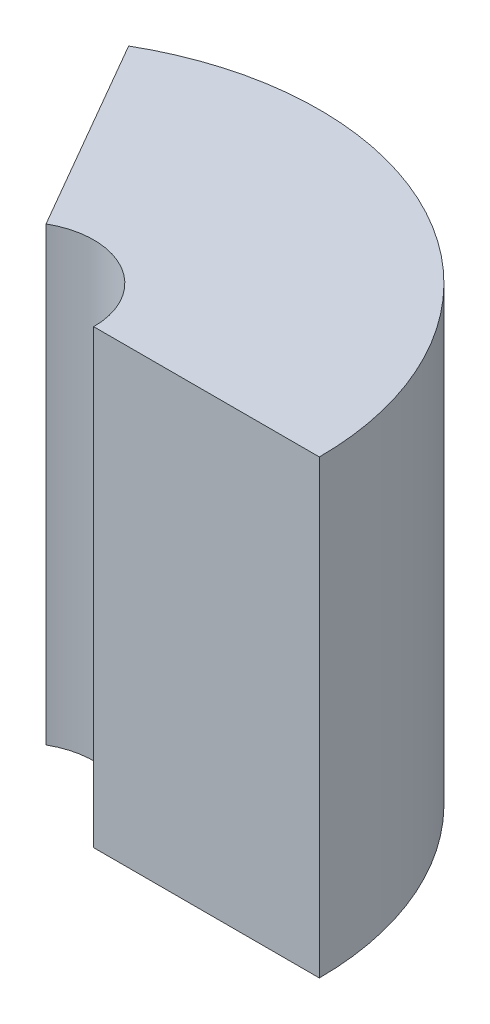
ISO-10303-21;
HEADER;
FILE_DESCRIPTION(('STEP AP214'),'2;1');
FILE_NAME('part.step','',(''),(''),'','','');
FILE_SCHEMA(('AUTOMOTIVE_DESIGN { 1 0 10303 214 1 1 1 1 }'));
ENDSEC;
DATA;
#1=APPLICATION_CONTEXT('core data for automotive mechanical design processes');
#2=APPLICATION_PROTOCOL_DEFINITION('international standard','automotive_design',2000,#1);
#3=PRODUCT_CONTEXT('',#1,'mechanical');
#4=PRODUCT('Part','Part','',(#3));
#5=PRODUCT_RELATED_PRODUCT_CATEGORY('part','',(#4));
#6=PRODUCT_DEFINITION_FORMATION('','',#4);
#7=PRODUCT_DEFINITION_CONTEXT('part definition',#1,'design');
#8=PRODUCT_DEFINITION('design','',#6,#7);
#9=PRODUCT_DEFINITION_SHAPE('','',#8);
#10=(LENGTH_UNIT() NAMED_UNIT(*) SI_UNIT(.MILLI.,.METRE.));
#11=(NAMED_UNIT(*) PLANE_ANGLE_UNIT() SI_UNIT($,.RADIAN.));
#12=(NAMED_UNIT(*) SI_UNIT($,.STERADIAN.) SOLID_ANGLE_UNIT());
#13=UNCERTAINTY_MEASURE_WITH_UNIT(LENGTH_MEASURE(1.E-05),#10,'distance_accuracy_value','');
#14=(GEOMETRIC_REPRESENTATION_CONTEXT(3) GLOBAL_UNCERTAINTY_ASSIGNED_CONTEXT((#13)) GLOBAL_UNIT_ASSIGNED_CONTEXT((#10,
#11,#12)) REPRESENTATION_CONTEXT('',''));
#15=CARTESIAN_POINT('',(0.,0.,0.));
#16=DIRECTION('',(0.,0.,1.));
#17=DIRECTION('',(1.,0.,0.));
#18=AXIS2_PLACEMENT_3D('',#15,#16,#17);
#19=CARTESIAN_POINT('',(0.,0.,0.));
#20=DIRECTION('',(0.,-1.,0.));
#21=DIRECTION('',(0.,0.,-1.));
#22=AXIS2_PLACEMENT_3D('',#19,#20,#21);
#23=CYLINDRICAL_SURFACE('',#22,5.);
#24=CARTESIAN_POINT('',(0.,0.,0.));
#25=DIRECTION('',(0.,-1.,0.));
#26=DIRECTION('',(0.,0.,-1.));
#27=AXIS2_PLACEMENT_3D('',#24,#25,#26);
#28=CIRCLE('',#27,5.);
#29=CARTESIAN_POINT('',(-2.5,0.,-4.33012701892219));
#30=VERTEX_POINT('',#29);
#31=CARTESIAN_POINT('',(5.,0.,0.));
#32=VERTEX_POINT('',#31);
#33=EDGE_CURVE('E11',#30,#32,#28,.T.);
#34=ORIENTED_EDGE('',*,*,#33,.T.);
#35=DIRECTION('',(0.,-1.,0.));
#36=VECTOR('',#35,1.);
#37=CARTESIAN_POINT('',(5.,30.,0.));
#38=LINE('',#37,#36);
#39=CARTESIAN_POINT('',(5.,30.,0.));
#40=VERTEX_POINT('',#39);
#41=EDGE_CURVE('E81',#40,#32,#38,.T.);
#42=ORIENTED_EDGE('',*,*,#41,.F.);
#43=CARTESIAN_POINT('',(0.,30.,0.));
#44=DIRECTION('',(0.,-1.,0.));
#45=DIRECTION('',(0.,0.,-1.));
#46=AXIS2_PLACEMENT_3D('',#43,#44,#45);
#47=CIRCLE('',#46,5.);
#48=CARTESIAN_POINT('',(-2.5,30.,-4.33012701892219));
#49=VERTEX_POINT('',#48);
#50=EDGE_CURVE('E56',#49,#40,#47,.T.);
#51=ORIENTED_EDGE('',*,*,#50,.F.);
#52=DIRECTION('',(0.,-1.,0.));
#53=VECTOR('',#52,1.);
#54=CARTESIAN_POINT('',(-2.5,30.,-4.33012701892219));
#55=LINE('',#54,#53);
#56=EDGE_CURVE('E83',#49,#30,#55,.T.);
#57=ORIENTED_EDGE('',*,*,#56,.T.);
#58=EDGE_LOOP('',(#34,#42,#51,#57));
#59=FACE_BOUND('',#58,.T.);
#60=ADVANCED_FACE('F41',(#59),#23,.F.);
#61=CARTESIAN_POINT('',(-2.5,0.,-4.33012701892219));
#62=DIRECTION('',(0.,-1.,0.));
#63=DIRECTION('',(0.,0.,-1.));
#64=AXIS2_PLACEMENT_3D('',#61,#62,#63);
#65=PLANE('',#64);
#66=CARTESIAN_POINT('',(0.,0.,0.));
#67=DIRECTION('',(0.,-1.,0.));
#68=DIRECTION('',(0.,0.,-1.));
#69=AXIS2_PLACEMENT_3D('',#66,#67,#68);
#70=CIRCLE('',#69,20.);
#71=CARTESIAN_POINT('',(-9.99999999999999,0.,-17.3205080756888));
#72=VERTEX_POINT('',#71);
#73=CARTESIAN_POINT('',(20.,0.,0.));
#74=VERTEX_POINT('',#73);
#75=EDGE_CURVE('E49',#72,#74,#70,.T.);
#76=ORIENTED_EDGE('',*,*,#75,.T.);
#77=DIRECTION('',(1.,0.,0.));
#78=VECTOR('',#77,1.);
#79=CARTESIAN_POINT('',(5.,0.,0.));
#80=LINE('',#79,#78);
#81=EDGE_CURVE('E92',#32,#74,#80,.T.);
#82=ORIENTED_EDGE('',*,*,#81,.F.);
#83=ORIENTED_EDGE('',*,*,#33,.F.);
#84=DIRECTION('',(-0.5,0.,-0.866025403784439));
#85=VECTOR('',#84,1.);
#86=CARTESIAN_POINT('',(-2.5,0.,-4.33012701892219));
#87=LINE('',#86,#85);
#88=EDGE_CURVE('E102',#30,#72,#87,.T.);
#89=ORIENTED_EDGE('',*,*,#88,.T.);
#90=EDGE_LOOP('',(#76,#82,#83,#89));
#91=FACE_BOUND('',#90,.T.);
#92=ADVANCED_FACE('F43',(#91),#65,.T.);
#93=CARTESIAN_POINT('',(0.,0.,0.));
#94=DIRECTION('',(0.,-1.,0.));
#95=DIRECTION('',(0.,0.,-1.));
#96=AXIS2_PLACEMENT_3D('',#93,#94,#95);
#97=CYLINDRICAL_SURFACE('',#96,20.);
#98=CARTESIAN_POINT('',(0.,30.,0.));
#99=DIRECTION('',(0.,-1.,0.));
#100=DIRECTION('',(0.,0.,-1.));
#101=AXIS2_PLACEMENT_3D('',#98,#99,#100);
#102=CIRCLE('',#101,20.);
#103=CARTESIAN_POINT('',(-9.99999999999999,30.,-17.3205080756888));
#104=VERTEX_POINT('',#103);
#105=CARTESIAN_POINT('',(20.,30.,0.));
#106=VERTEX_POINT('',#105);
#107=EDGE_CURVE('E64',#104,#106,#102,.T.);
#108=ORIENTED_EDGE('',*,*,#107,.T.);
#109=DIRECTION('',(0.,1.,0.));
#110=VECTOR('',#109,1.);
#111=CARTESIAN_POINT('',(20.,0.,0.));
#112=LINE('',#111,#110);
#113=EDGE_CURVE('E96',#74,#106,#112,.T.);
#114=ORIENTED_EDGE('',*,*,#113,.F.);
#115=ORIENTED_EDGE('',*,*,#75,.F.);
#116=DIRECTION('',(0.,1.,0.));
#117=VECTOR('',#116,1.);
#118=CARTESIAN_POINT('',(-9.99999999999999,0.,-17.3205080756888));
#119=LINE('',#118,#117);
#120=EDGE_CURVE('E104',#72,#104,#119,.T.);
#121=ORIENTED_EDGE('',*,*,#120,.T.);
#122=EDGE_LOOP('',(#108,#114,#115,#121));
#123=FACE_BOUND('',#122,.T.);
#124=ADVANCED_FACE('F110',(#123),#97,.T.);
#125=CARTESIAN_POINT('',(-9.99999999999999,30.,-17.3205080756888));
#126=DIRECTION('',(0.,1.,0.));
#127=DIRECTION('',(0.,0.,1.));
#128=AXIS2_PLACEMENT_3D('',#125,#126,#127);
#129=PLANE('',#128);
#130=DIRECTION('',(0.5,0.,0.866025403784439));
#131=VECTOR('',#130,1.);
#132=CARTESIAN_POINT('',(-9.99999999999999,30.,-17.3205080756888));
#133=LINE('',#132,#131);
#134=EDGE_CURVE('E106',#104,#49,#133,.T.);
#135=ORIENTED_EDGE('',*,*,#134,.T.);
#136=ORIENTED_EDGE('',*,*,#50,.T.);
#137=DIRECTION('',(-1.,0.,0.));
#138=VECTOR('',#137,1.);
#139=CARTESIAN_POINT('',(20.,30.,0.));
#140=LINE('',#139,#138);
#141=EDGE_CURVE('E94',#106,#40,#140,.T.);
#142=ORIENTED_EDGE('',*,*,#141,.F.);
#143=ORIENTED_EDGE('',*,*,#107,.F.);
#144=EDGE_LOOP('',(#135,#136,#142,#143));
#145=FACE_BOUND('',#144,.T.);
#146=ADVANCED_FACE('F113',(#145),#129,.T.);
#147=CARTESIAN_POINT('',(0.,0.,0.));
#148=DIRECTION('',(0.866025403784439,0.,-0.5));
#149=DIRECTION('',(-0.5,0.,-0.866025403784439));
#150=AXIS2_PLACEMENT_3D('',#147,#148,#149);
#151=PLANE('',#150);
#152=ORIENTED_EDGE('',*,*,#56,.F.);
#153=ORIENTED_EDGE('',*,*,#134,.F.);
#154=ORIENTED_EDGE('',*,*,#120,.F.);
#155=ORIENTED_EDGE('',*,*,#88,.F.);
#156=EDGE_LOOP('',(#152,#153,#154,#155));
#157=FACE_BOUND('',#156,.T.);
#158=ADVANCED_FACE('F115',(#157),#151,.F.);
#159=CARTESIAN_POINT('',(0.,0.,0.));
#160=DIRECTION('',(0.,0.,1.));
#161=DIRECTION('',(1.,0.,0.));
#162=AXIS2_PLACEMENT_3D('',#159,#160,#161);
#163=PLANE('',#162);
#164=ORIENTED_EDGE('',*,*,#41,.T.);
#165=ORIENTED_EDGE('',*,*,#81,.T.);
#166=ORIENTED_EDGE('',*,*,#113,.T.);
#167=ORIENTED_EDGE('',*,*,#141,.T.);
#168=EDGE_LOOP('',(#164,#165,#166,#167));
#169=FACE_BOUND('',#168,.T.);
#170=ADVANCED_FACE('F90',(#169),#163,.T.);
#171=CLOSED_SHELL('',(#60,#92,#124,#146,#158,#170));
#172=MANIFOLD_SOLID_BREP('B2',#171);
#173=ADVANCED_BREP_SHAPE_REPRESENTATION('',(#18,#172),#14);
#174=SHAPE_DEFINITION_REPRESENTATION(#9,#173);
ENDSEC;
END-ISO-10303-21;
